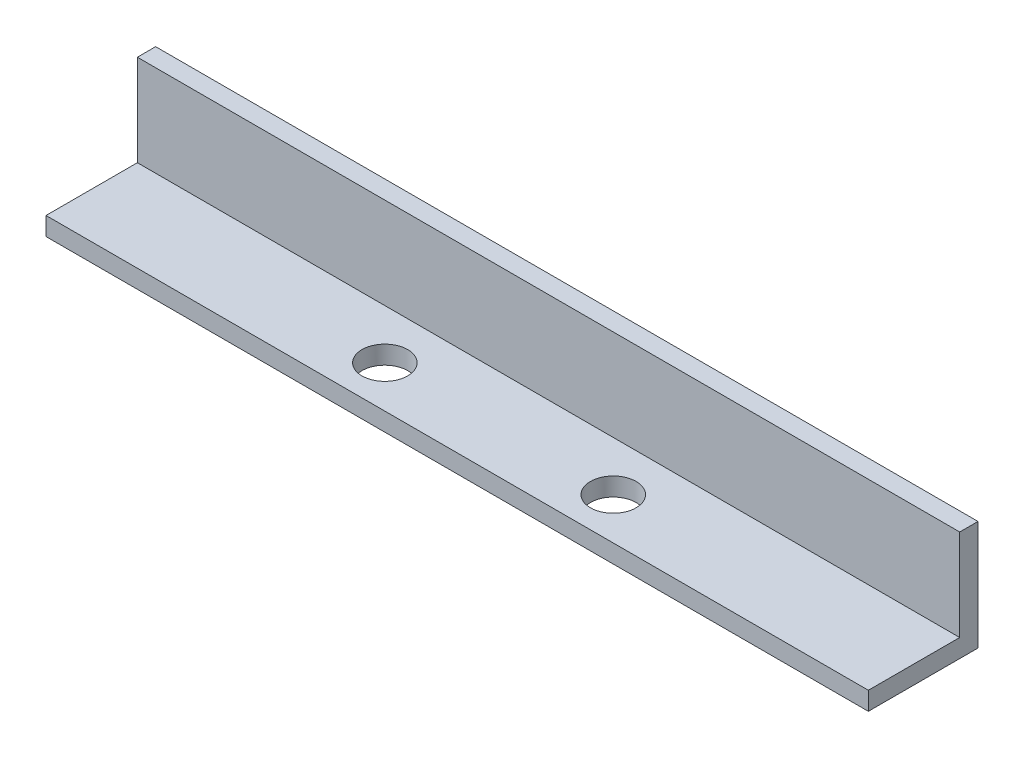
ISO-10303-21;
HEADER;
FILE_DESCRIPTION(('STEP AP214'),'2;1');
FILE_NAME('part.step','',(''),(''),'','','');
FILE_SCHEMA(('AUTOMOTIVE_DESIGN { 1 0 10303 214 1 1 1 1 }'));
ENDSEC;
DATA;
#1=APPLICATION_CONTEXT('core data for automotive mechanical design processes');
#2=APPLICATION_PROTOCOL_DEFINITION('international standard','automotive_design',2000,#1);
#3=PRODUCT_CONTEXT('',#1,'mechanical');
#4=PRODUCT('Part','Part','',(#3));
#5=PRODUCT_RELATED_PRODUCT_CATEGORY('part','',(#4));
#6=PRODUCT_DEFINITION_FORMATION('','',#4);
#7=PRODUCT_DEFINITION_CONTEXT('part definition',#1,'design');
#8=PRODUCT_DEFINITION('design','',#6,#7);
#9=PRODUCT_DEFINITION_SHAPE('','',#8);
#10=(LENGTH_UNIT() NAMED_UNIT(*) SI_UNIT(.MILLI.,.METRE.));
#11=(NAMED_UNIT(*) PLANE_ANGLE_UNIT() SI_UNIT($,.RADIAN.));
#12=(NAMED_UNIT(*) SI_UNIT($,.STERADIAN.) SOLID_ANGLE_UNIT());
#13=UNCERTAINTY_MEASURE_WITH_UNIT(LENGTH_MEASURE(1.E-05),#10,'distance_accuracy_value','');
#14=(GEOMETRIC_REPRESENTATION_CONTEXT(3) GLOBAL_UNCERTAINTY_ASSIGNED_CONTEXT((#13)) GLOBAL_UNIT_ASSIGNED_CONTEXT((#10,
#11,#12)) REPRESENTATION_CONTEXT('',''));
#15=CARTESIAN_POINT('',(0.,0.,0.));
#16=DIRECTION('',(0.,0.,1.));
#17=DIRECTION('',(1.,0.,0.));
#18=AXIS2_PLACEMENT_3D('',#15,#16,#17);
#19=CARTESIAN_POINT('',(0.,2.,0.));
#20=DIRECTION('',(0.,-1.,0.));
#21=DIRECTION('',(0.,0.,-1.));
#22=AXIS2_PLACEMENT_3D('',#19,#20,#21);
#23=PLANE('',#22);
#24=CARTESIAN_POINT('',(-28.6666666666666,2.,0.));
#25=DIRECTION('',(0.,-1.,0.));
#26=DIRECTION('',(0.,0.,-1.));
#27=AXIS2_PLACEMENT_3D('',#24,#25,#26);
#28=CIRCLE('',#27,2.5);
#29=CARTESIAN_POINT('',(-28.6666666666666,2.,-2.5));
#30=VERTEX_POINT('',#29);
#31=EDGE_CURVE('E136',#30,#30,#28,.T.);
#32=ORIENTED_EDGE('',*,*,#31,.T.);
#33=EDGE_LOOP('',(#32));
#34=FACE_BOUND('',#33,.T.);
#35=CARTESIAN_POINT('',(-3.66666666666664,2.,0.));
#36=DIRECTION('',(0.,-1.,0.));
#37=DIRECTION('',(0.,0.,-1.));
#38=AXIS2_PLACEMENT_3D('',#35,#36,#37);
#39=CIRCLE('',#38,2.5);
#40=CARTESIAN_POINT('',(-3.66666666666664,2.,-2.5));
#41=VERTEX_POINT('',#40);
#42=EDGE_CURVE('E150',#41,#41,#39,.T.);
#43=ORIENTED_EDGE('',*,*,#42,.T.);
#44=EDGE_LOOP('',(#43));
#45=FACE_BOUND('',#44,.T.);
#46=DIRECTION('',(1.,0.,0.));
#47=VECTOR('',#46,1.);
#48=CARTESIAN_POINT('',(-61.1666666666666,2.,-5.41666666666666));
#49=LINE('',#48,#47);
#50=CARTESIAN_POINT('',(-61.1666666666666,2.,-5.41666666666666));
#51=VERTEX_POINT('',#50);
#52=CARTESIAN_POINT('',(28.8333333333334,2.,-5.41666666666666));
#53=VERTEX_POINT('',#52);
#54=EDGE_CURVE('E52',#51,#53,#49,.T.);
#55=ORIENTED_EDGE('',*,*,#54,.F.);
#56=DIRECTION('',(0.,0.,1.));
#57=VECTOR('',#56,1.);
#58=CARTESIAN_POINT('',(-61.1666666666666,2.,4.58333333333334));
#59=LINE('',#58,#57);
#60=CARTESIAN_POINT('',(-61.1666666666666,2.,4.58333333333334));
#61=VERTEX_POINT('',#60);
#62=EDGE_CURVE('E138',#51,#61,#59,.T.);
#63=ORIENTED_EDGE('',*,*,#62,.T.);
#64=DIRECTION('',(1.,0.,0.));
#65=VECTOR('',#64,1.);
#66=CARTESIAN_POINT('',(-61.1666666666666,2.,4.58333333333334));
#67=LINE('',#66,#65);
#68=CARTESIAN_POINT('',(28.8333333333334,2.,4.58333333333334));
#69=VERTEX_POINT('',#68);
#70=EDGE_CURVE('E58',#61,#69,#67,.T.);
#71=ORIENTED_EDGE('',*,*,#70,.T.);
#72=DIRECTION('',(0.,0.,-1.));
#73=VECTOR('',#72,1.);
#74=CARTESIAN_POINT('',(28.8333333333334,2.,4.58333333333334));
#75=LINE('',#74,#73);
#76=EDGE_CURVE('E87',#69,#53,#75,.T.);
#77=ORIENTED_EDGE('',*,*,#76,.T.);
#78=EDGE_LOOP('',(#55,#63,#71,#77));
#79=FACE_BOUND('',#78,.T.);
#80=ADVANCED_FACE('F37',(#34,#45,#79),#23,.F.);
#81=CARTESIAN_POINT('',(28.8333333333334,2.,4.58333333333334));
#82=DIRECTION('',(-1.,0.,0.));
#83=DIRECTION('',(0.,0.,1.));
#84=AXIS2_PLACEMENT_3D('',#81,#82,#83);
#85=PLANE('',#84);
#86=DIRECTION('',(0.,0.,-1.));
#87=VECTOR('',#86,1.);
#88=CARTESIAN_POINT('',(28.8333333333334,0.,4.58333333333334));
#89=LINE('',#88,#87);
#90=CARTESIAN_POINT('',(28.8333333333334,0.,4.58333333333334));
#91=VERTEX_POINT('',#90);
#92=CARTESIAN_POINT('',(28.8333333333334,0.,-7.41666666666666));
#93=VERTEX_POINT('',#92);
#94=EDGE_CURVE('E93',#91,#93,#89,.T.);
#95=ORIENTED_EDGE('',*,*,#94,.T.);
#96=DIRECTION('',(0.,-1.,0.));
#97=VECTOR('',#96,1.);
#98=CARTESIAN_POINT('',(28.8333333333334,2.,-7.41666666666666));
#99=LINE('',#98,#97);
#100=CARTESIAN_POINT('',(28.8333333333334,12.,-7.41666666666666));
#101=VERTEX_POINT('',#100);
#102=EDGE_CURVE('E11',#101,#93,#99,.T.);
#103=ORIENTED_EDGE('',*,*,#102,.F.);
#104=DIRECTION('',(0.,0.,-1.));
#105=VECTOR('',#104,1.);
#106=CARTESIAN_POINT('',(28.8333333333334,12.,-7.41666666666666));
#107=LINE('',#106,#105);
#108=CARTESIAN_POINT('',(28.8333333333334,12.,-5.41666666666666));
#109=VERTEX_POINT('',#108);
#110=EDGE_CURVE('E129',#109,#101,#107,.T.);
#111=ORIENTED_EDGE('',*,*,#110,.F.);
#112=DIRECTION('',(0.,-1.,0.));
#113=VECTOR('',#112,1.);
#114=CARTESIAN_POINT('',(28.8333333333334,12.,-5.41666666666666));
#115=LINE('',#114,#113);
#116=EDGE_CURVE('E102',#109,#53,#115,.T.);
#117=ORIENTED_EDGE('',*,*,#116,.T.);
#118=ORIENTED_EDGE('',*,*,#76,.F.);
#119=DIRECTION('',(0.,-1.,0.));
#120=VECTOR('',#119,1.);
#121=CARTESIAN_POINT('',(28.8333333333334,2.,4.58333333333334));
#122=LINE('',#121,#120);
#123=EDGE_CURVE('E80',#69,#91,#122,.T.);
#124=ORIENTED_EDGE('',*,*,#123,.T.);
#125=EDGE_LOOP('',(#95,#103,#111,#117,#118,#124));
#126=FACE_BOUND('',#125,.T.);
#127=ADVANCED_FACE('F39',(#126),#85,.F.);
#128=CARTESIAN_POINT('',(-61.1666666666666,2.,-7.41666666666666));
#129=DIRECTION('',(0.,0.,1.));
#130=DIRECTION('',(1.,0.,0.));
#131=AXIS2_PLACEMENT_3D('',#128,#129,#130);
#132=PLANE('',#131);
#133=DIRECTION('',(-1.,0.,0.));
#134=VECTOR('',#133,1.);
#135=CARTESIAN_POINT('',(-61.1666666666666,0.,-7.41666666666666));
#136=LINE('',#135,#134);
#137=CARTESIAN_POINT('',(-61.1666666666666,0.,-7.41666666666666));
#138=VERTEX_POINT('',#137);
#139=EDGE_CURVE('E97',#93,#138,#136,.T.);
#140=ORIENTED_EDGE('',*,*,#139,.T.);
#141=DIRECTION('',(0.,-1.,0.));
#142=VECTOR('',#141,1.);
#143=CARTESIAN_POINT('',(-61.1666666666666,2.,-7.41666666666666));
#144=LINE('',#143,#142);
#145=CARTESIAN_POINT('',(-61.1666666666666,12.,-7.41666666666666));
#146=VERTEX_POINT('',#145);
#147=EDGE_CURVE('E45',#146,#138,#144,.T.);
#148=ORIENTED_EDGE('',*,*,#147,.F.);
#149=DIRECTION('',(-1.,0.,0.));
#150=VECTOR('',#149,1.);
#151=CARTESIAN_POINT('',(-61.1666666666666,12.,-7.41666666666666));
#152=LINE('',#151,#150);
#153=EDGE_CURVE('E121',#101,#146,#152,.T.);
#154=ORIENTED_EDGE('',*,*,#153,.F.);
#155=ORIENTED_EDGE('',*,*,#102,.T.);
#156=EDGE_LOOP('',(#140,#148,#154,#155));
#157=FACE_BOUND('',#156,.T.);
#158=ADVANCED_FACE('F119',(#157),#132,.F.);
#159=CARTESIAN_POINT('',(-61.1666666666666,2.,4.58333333333334));
#160=DIRECTION('',(1.,0.,0.));
#161=DIRECTION('',(0.,0.,-1.));
#162=AXIS2_PLACEMENT_3D('',#159,#160,#161);
#163=PLANE('',#162);
#164=DIRECTION('',(0.,0.,1.));
#165=VECTOR('',#164,1.);
#166=CARTESIAN_POINT('',(-61.1666666666666,0.,4.58333333333334));
#167=LINE('',#166,#165);
#168=CARTESIAN_POINT('',(-61.1666666666666,0.,4.58333333333334));
#169=VERTEX_POINT('',#168);
#170=EDGE_CURVE('E88',#138,#169,#167,.T.);
#171=ORIENTED_EDGE('',*,*,#170,.T.);
#172=DIRECTION('',(0.,-1.,0.));
#173=VECTOR('',#172,1.);
#174=CARTESIAN_POINT('',(-61.1666666666666,2.,4.58333333333334));
#175=LINE('',#174,#173);
#176=EDGE_CURVE('E83',#61,#169,#175,.T.);
#177=ORIENTED_EDGE('',*,*,#176,.F.);
#178=ORIENTED_EDGE('',*,*,#62,.F.);
#179=DIRECTION('',(0.,-1.,0.));
#180=VECTOR('',#179,1.);
#181=CARTESIAN_POINT('',(-61.1666666666666,12.,-5.41666666666666));
#182=LINE('',#181,#180);
#183=CARTESIAN_POINT('',(-61.1666666666666,12.,-5.41666666666666));
#184=VERTEX_POINT('',#183);
#185=EDGE_CURVE('E98',#184,#51,#182,.T.);
#186=ORIENTED_EDGE('',*,*,#185,.F.);
#187=DIRECTION('',(0.,0.,1.));
#188=VECTOR('',#187,1.);
#189=CARTESIAN_POINT('',(-61.1666666666666,12.,-7.41666666666666));
#190=LINE('',#189,#188);
#191=EDGE_CURVE('E115',#146,#184,#190,.T.);
#192=ORIENTED_EDGE('',*,*,#191,.F.);
#193=ORIENTED_EDGE('',*,*,#147,.T.);
#194=EDGE_LOOP('',(#171,#177,#178,#186,#192,#193));
#195=FACE_BOUND('',#194,.T.);
#196=ADVANCED_FACE('F112',(#195),#163,.F.);
#197=CARTESIAN_POINT('',(-61.1666666666666,2.,4.58333333333334));
#198=DIRECTION('',(0.,0.,-1.));
#199=DIRECTION('',(-1.,0.,0.));
#200=AXIS2_PLACEMENT_3D('',#197,#198,#199);
#201=PLANE('',#200);
#202=DIRECTION('',(1.,0.,0.));
#203=VECTOR('',#202,1.);
#204=CARTESIAN_POINT('',(-61.1666666666666,0.,4.58333333333334));
#205=LINE('',#204,#203);
#206=EDGE_CURVE('E77',#169,#91,#205,.T.);
#207=ORIENTED_EDGE('',*,*,#206,.T.);
#208=ORIENTED_EDGE('',*,*,#123,.F.);
#209=ORIENTED_EDGE('',*,*,#70,.F.);
#210=ORIENTED_EDGE('',*,*,#176,.T.);
#211=EDGE_LOOP('',(#207,#208,#209,#210));
#212=FACE_BOUND('',#211,.T.);
#213=ADVANCED_FACE('F79',(#212),#201,.F.);
#214=CARTESIAN_POINT('',(0.,0.,0.));
#215=DIRECTION('',(0.,-1.,0.));
#216=DIRECTION('',(0.,0.,-1.));
#217=AXIS2_PLACEMENT_3D('',#214,#215,#216);
#218=PLANE('',#217);
#219=CARTESIAN_POINT('',(-28.6666666666666,0.,0.));
#220=DIRECTION('',(0.,1.,0.));
#221=DIRECTION('',(0.,0.,1.));
#222=AXIS2_PLACEMENT_3D('',#219,#220,#221);
#223=CIRCLE('',#222,2.5);
#224=CARTESIAN_POINT('',(-28.6666666666666,0.,2.5));
#225=VERTEX_POINT('',#224);
#226=EDGE_CURVE('E153',#225,#225,#223,.T.);
#227=ORIENTED_EDGE('',*,*,#226,.T.);
#228=EDGE_LOOP('',(#227));
#229=FACE_BOUND('',#228,.T.);
#230=CARTESIAN_POINT('',(-3.66666666666664,0.,0.));
#231=DIRECTION('',(0.,1.,0.));
#232=DIRECTION('',(0.,0.,1.));
#233=AXIS2_PLACEMENT_3D('',#230,#231,#232);
#234=CIRCLE('',#233,2.5);
#235=CARTESIAN_POINT('',(-3.66666666666664,0.,2.5));
#236=VERTEX_POINT('',#235);
#237=EDGE_CURVE('E154',#236,#236,#234,.T.);
#238=ORIENTED_EDGE('',*,*,#237,.T.);
#239=EDGE_LOOP('',(#238));
#240=FACE_BOUND('',#239,.T.);
#241=ORIENTED_EDGE('',*,*,#94,.F.);
#242=ORIENTED_EDGE('',*,*,#206,.F.);
#243=ORIENTED_EDGE('',*,*,#170,.F.);
#244=ORIENTED_EDGE('',*,*,#139,.F.);
#245=EDGE_LOOP('',(#241,#242,#243,#244));
#246=FACE_BOUND('',#245,.T.);
#247=ADVANCED_FACE('F96',(#229,#240,#246),#218,.T.);
#248=CARTESIAN_POINT('',(-61.1666666666666,12.,-5.41666666666666));
#249=DIRECTION('',(0.,0.,-1.));
#250=DIRECTION('',(-1.,0.,0.));
#251=AXIS2_PLACEMENT_3D('',#248,#249,#250);
#252=PLANE('',#251);
#253=ORIENTED_EDGE('',*,*,#54,.T.);
#254=ORIENTED_EDGE('',*,*,#116,.F.);
#255=DIRECTION('',(1.,0.,0.));
#256=VECTOR('',#255,1.);
#257=CARTESIAN_POINT('',(-61.1666666666666,12.,-5.41666666666666));
#258=LINE('',#257,#256);
#259=EDGE_CURVE('E132',#184,#109,#258,.T.);
#260=ORIENTED_EDGE('',*,*,#259,.F.);
#261=ORIENTED_EDGE('',*,*,#185,.T.);
#262=EDGE_LOOP('',(#253,#254,#260,#261));
#263=FACE_BOUND('',#262,.T.);
#264=ADVANCED_FACE('F141',(#263),#252,.F.);
#265=CARTESIAN_POINT('',(0.,12.,0.));
#266=DIRECTION('',(0.,1.,0.));
#267=DIRECTION('',(0.,0.,1.));
#268=AXIS2_PLACEMENT_3D('',#265,#266,#267);
#269=PLANE('',#268);
#270=ORIENTED_EDGE('',*,*,#191,.T.);
#271=ORIENTED_EDGE('',*,*,#259,.T.);
#272=ORIENTED_EDGE('',*,*,#110,.T.);
#273=ORIENTED_EDGE('',*,*,#153,.T.);
#274=EDGE_LOOP('',(#270,#271,#272,#273));
#275=FACE_BOUND('',#274,.T.);
#276=ADVANCED_FACE('F125',(#275),#269,.T.);
#277=CARTESIAN_POINT('',(-3.66666666666664,0.,0.));
#278=DIRECTION('',(0.,1.,0.));
#279=DIRECTION('',(0.,0.,1.));
#280=AXIS2_PLACEMENT_3D('',#277,#278,#279);
#281=CYLINDRICAL_SURFACE('',#280,2.5);
#282=ORIENTED_EDGE('',*,*,#237,.F.);
#283=EDGE_LOOP('',(#282));
#284=FACE_BOUND('',#283,.T.);
#285=ORIENTED_EDGE('',*,*,#42,.F.);
#286=EDGE_LOOP('',(#285));
#287=FACE_BOUND('',#286,.T.);
#288=ADVANCED_FACE('F165',(#284,#287),#281,.F.);
#289=CARTESIAN_POINT('',(-28.6666666666666,0.,0.));
#290=DIRECTION('',(0.,1.,0.));
#291=DIRECTION('',(0.,0.,1.));
#292=AXIS2_PLACEMENT_3D('',#289,#290,#291);
#293=CYLINDRICAL_SURFACE('',#292,2.5);
#294=ORIENTED_EDGE('',*,*,#226,.F.);
#295=EDGE_LOOP('',(#294));
#296=FACE_BOUND('',#295,.T.);
#297=ORIENTED_EDGE('',*,*,#31,.F.);
#298=EDGE_LOOP('',(#297));
#299=FACE_BOUND('',#298,.T.);
#300=ADVANCED_FACE('F162',(#296,#299),#293,.F.);
#301=CLOSED_SHELL('',(#80,#127,#158,#196,#213,#247,#264,#276,#288,#300));
#302=MANIFOLD_SOLID_BREP('B2',#301);
#303=ADVANCED_BREP_SHAPE_REPRESENTATION('',(#18,#302),#14);
#304=SHAPE_DEFINITION_REPRESENTATION(#9,#303);
ENDSEC;
END-ISO-10303-21;
